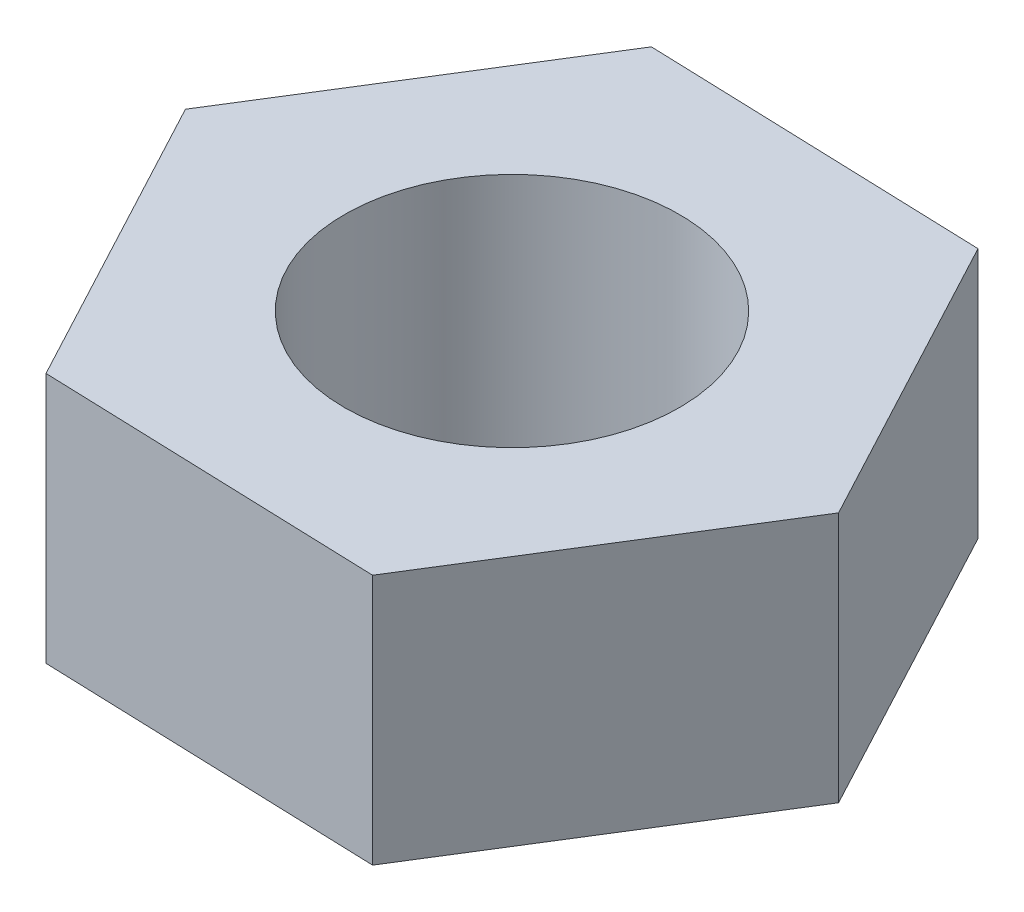
ISO-10303-21;
HEADER;
FILE_DESCRIPTION(('STEP AP214'),'2;1');
FILE_NAME('part.step','',(''),(''),'','','');
FILE_SCHEMA(('AUTOMOTIVE_DESIGN { 1 0 10303 214 1 1 1 1 }'));
ENDSEC;
DATA;
#1=APPLICATION_CONTEXT('core data for automotive mechanical design processes');
#2=APPLICATION_PROTOCOL_DEFINITION('international standard','automotive_design',2000,#1);
#3=PRODUCT_CONTEXT('',#1,'mechanical');
#4=PRODUCT('Part','Part','',(#3));
#5=PRODUCT_RELATED_PRODUCT_CATEGORY('part','',(#4));
#6=PRODUCT_DEFINITION_FORMATION('','',#4);
#7=PRODUCT_DEFINITION_CONTEXT('part definition',#1,'design');
#8=PRODUCT_DEFINITION('design','',#6,#7);
#9=PRODUCT_DEFINITION_SHAPE('','',#8);
#10=(LENGTH_UNIT() NAMED_UNIT(*) SI_UNIT(.MILLI.,.METRE.));
#11=(NAMED_UNIT(*) PLANE_ANGLE_UNIT() SI_UNIT($,.RADIAN.));
#12=(NAMED_UNIT(*) SI_UNIT($,.STERADIAN.) SOLID_ANGLE_UNIT());
#13=UNCERTAINTY_MEASURE_WITH_UNIT(LENGTH_MEASURE(1.E-05),#10,'distance_accuracy_value','');
#14=(GEOMETRIC_REPRESENTATION_CONTEXT(3) GLOBAL_UNCERTAINTY_ASSIGNED_CONTEXT((#13)) GLOBAL_UNIT_ASSIGNED_CONTEXT((#10,
#11,#12)) REPRESENTATION_CONTEXT('',''));
#15=CARTESIAN_POINT('',(0.,0.,0.));
#16=DIRECTION('',(0.,0.,1.));
#17=DIRECTION('',(1.,0.,0.));
#18=AXIS2_PLACEMENT_3D('',#15,#16,#17);
#19=CARTESIAN_POINT('',(0.,0.,0.));
#20=DIRECTION('',(0.,1.,0.));
#21=DIRECTION('',(0.,0.,1.));
#22=AXIS2_PLACEMENT_3D('',#19,#20,#21);
#23=CYLINDRICAL_SURFACE('',#22,2.);
#24=CARTESIAN_POINT('',(0.,0.,0.));
#25=DIRECTION('',(0.,1.,0.));
#26=DIRECTION('',(0.,0.,1.));
#27=AXIS2_PLACEMENT_3D('',#24,#25,#26);
#28=CIRCLE('',#27,2.);
#29=CARTESIAN_POINT('',(0.,0.,2.));
#30=VERTEX_POINT('',#29);
#31=EDGE_CURVE('E127',#30,#30,#28,.T.);
#32=ORIENTED_EDGE('',*,*,#31,.F.);
#33=EDGE_LOOP('',(#32));
#34=FACE_BOUND('',#33,.T.);
#35=CARTESIAN_POINT('',(0.,3.,0.));
#36=DIRECTION('',(0.,1.,0.));
#37=DIRECTION('',(0.,0.,1.));
#38=AXIS2_PLACEMENT_3D('',#35,#36,#37);
#39=CIRCLE('',#38,2.);
#40=CARTESIAN_POINT('',(0.,3.,2.));
#41=VERTEX_POINT('',#40);
#42=EDGE_CURVE('E41',#41,#41,#39,.F.);
#43=ORIENTED_EDGE('',*,*,#42,.F.);
#44=EDGE_LOOP('',(#43));
#45=FACE_BOUND('',#44,.T.);
#46=ADVANCED_FACE('F37',(#34,#45),#23,.F.);
#47=CARTESIAN_POINT('',(1.90071687975874,3.,3.56659623118927));
#48=DIRECTION('',(-0.848548322984266,0.,-0.529117891930135));
#49=DIRECTION('',(-0.529117891930135,0.,0.848548322984266));
#50=AXIS2_PLACEMENT_3D('',#47,#48,#49);
#51=PLANE('',#50);
#52=DIRECTION('',(0.529117891930135,0.,-0.848548322984266));
#53=VECTOR('',#52,1.);
#54=CARTESIAN_POINT('',(1.90071687975874,0.,3.56659623118927));
#55=LINE('',#54,#53);
#56=CARTESIAN_POINT('',(1.90071687975874,0.,3.56659623118927));
#57=VERTEX_POINT('',#56);
#58=CARTESIAN_POINT('',(4.03912138113112,0.,0.137229012321677));
#59=VERTEX_POINT('',#58);
#60=EDGE_CURVE('E123',#57,#59,#55,.T.);
#61=ORIENTED_EDGE('',*,*,#60,.T.);
#62=DIRECTION('',(0.,-1.,0.));
#63=VECTOR('',#62,1.);
#64=CARTESIAN_POINT('',(4.03912138113112,3.,0.137229012321677));
#65=LINE('',#64,#63);
#66=CARTESIAN_POINT('',(4.03912138113112,3.,0.137229012321677));
#67=VERTEX_POINT('',#66);
#68=EDGE_CURVE('E11',#67,#59,#65,.T.);
#69=ORIENTED_EDGE('',*,*,#68,.F.);
#70=DIRECTION('',(0.529117891930135,0.,-0.848548322984266));
#71=VECTOR('',#70,1.);
#72=CARTESIAN_POINT('',(1.90071687975874,3.,3.56659623118927));
#73=LINE('',#72,#71);
#74=CARTESIAN_POINT('',(1.90071687975874,3.,3.56659623118927));
#75=VERTEX_POINT('',#74);
#76=EDGE_CURVE('E90',#75,#67,#73,.T.);
#77=ORIENTED_EDGE('',*,*,#76,.F.);
#78=DIRECTION('',(0.,-1.,0.));
#79=VECTOR('',#78,1.);
#80=CARTESIAN_POINT('',(1.90071687975874,3.,3.56659623118927));
#81=LINE('',#80,#79);
#82=EDGE_CURVE('E119',#75,#57,#81,.T.);
#83=ORIENTED_EDGE('',*,*,#82,.T.);
#84=EDGE_LOOP('',(#61,#69,#77,#83));
#85=FACE_BOUND('',#84,.T.);
#86=ADVANCED_FACE('F39',(#85),#51,.F.);
#87=CARTESIAN_POINT('',(4.03912138113112,3.,0.137229012321677));
#88=DIRECTION('',(-0.882503697500499,0.,0.470305458077989));
#89=DIRECTION('',(0.470305458077989,0.,0.882503697500499));
#90=AXIS2_PLACEMENT_3D('',#87,#88,#89);
#91=PLANE('',#90);
#92=DIRECTION('',(-0.470305458077989,0.,-0.882503697500499));
#93=VECTOR('',#92,1.);
#94=CARTESIAN_POINT('',(4.03912138113112,0.,0.137229012321677));
#95=LINE('',#94,#93);
#96=CARTESIAN_POINT('',(2.13840450137238,0.,-3.4293672188676));
#97=VERTEX_POINT('',#96);
#98=EDGE_CURVE('E126',#59,#97,#95,.T.);
#99=ORIENTED_EDGE('',*,*,#98,.T.);
#100=DIRECTION('',(0.,-1.,0.));
#101=VECTOR('',#100,1.);
#102=CARTESIAN_POINT('',(2.13840450137238,3.,-3.4293672188676));
#103=LINE('',#102,#101);
#104=CARTESIAN_POINT('',(2.13840450137238,3.,-3.4293672188676));
#105=VERTEX_POINT('',#104);
#106=EDGE_CURVE('E47',#105,#97,#103,.T.);
#107=ORIENTED_EDGE('',*,*,#106,.F.);
#108=DIRECTION('',(-0.470305458077989,0.,-0.882503697500499));
#109=VECTOR('',#108,1.);
#110=CARTESIAN_POINT('',(4.03912138113112,3.,0.137229012321677));
#111=LINE('',#110,#109);
#112=EDGE_CURVE('E179',#67,#105,#111,.T.);
#113=ORIENTED_EDGE('',*,*,#112,.F.);
#114=ORIENTED_EDGE('',*,*,#68,.T.);
#115=EDGE_LOOP('',(#99,#107,#113,#114));
#116=FACE_BOUND('',#115,.T.);
#117=ADVANCED_FACE('F166',(#116),#91,.F.);
#118=CARTESIAN_POINT('',(2.13840450137238,3.,-3.4293672188676));
#119=DIRECTION('',(-0.0339553745162337,0.,0.999423350008124));
#120=DIRECTION('',(0.999423350008125,0.,0.0339553745162337));
#121=AXIS2_PLACEMENT_3D('',#118,#119,#120);
#122=PLANE('',#121);
#123=DIRECTION('',(-0.999423350008125,0.,-0.0339553745162337));
#124=VECTOR('',#123,1.);
#125=CARTESIAN_POINT('',(2.13840450137238,0.,-3.4293672188676));
#126=LINE('',#125,#124);
#127=CARTESIAN_POINT('',(-1.90071687975874,0.,-3.56659623118928));
#128=VERTEX_POINT('',#127);
#129=EDGE_CURVE('E129',#97,#128,#126,.T.);
#130=ORIENTED_EDGE('',*,*,#129,.T.);
#131=DIRECTION('',(0.,-1.,0.));
#132=VECTOR('',#131,1.);
#133=CARTESIAN_POINT('',(-1.90071687975874,3.,-3.56659623118928));
#134=LINE('',#133,#132);
#135=CARTESIAN_POINT('',(-1.90071687975874,3.,-3.56659623118928));
#136=VERTEX_POINT('',#135);
#137=EDGE_CURVE('E114',#136,#128,#134,.T.);
#138=ORIENTED_EDGE('',*,*,#137,.F.);
#139=DIRECTION('',(-0.999423350008125,0.,-0.0339553745162337));
#140=VECTOR('',#139,1.);
#141=CARTESIAN_POINT('',(2.13840450137238,3.,-3.4293672188676));
#142=LINE('',#141,#140);
#143=EDGE_CURVE('E105',#105,#136,#142,.T.);
#144=ORIENTED_EDGE('',*,*,#143,.F.);
#145=ORIENTED_EDGE('',*,*,#106,.T.);
#146=EDGE_LOOP('',(#130,#138,#144,#145));
#147=FACE_BOUND('',#146,.T.);
#148=ADVANCED_FACE('F141',(#147),#122,.F.);
#149=CARTESIAN_POINT('',(-1.90071687975874,3.,-3.56659623118928));
#150=DIRECTION('',(0.848548322984266,0.,0.529117891930135));
#151=DIRECTION('',(0.529117891930135,0.,-0.848548322984266));
#152=AXIS2_PLACEMENT_3D('',#149,#150,#151);
#153=PLANE('',#152);
#154=DIRECTION('',(-0.529117891930136,0.,0.848548322984266));
#155=VECTOR('',#154,1.);
#156=CARTESIAN_POINT('',(-1.90071687975874,0.,-3.56659623118928));
#157=LINE('',#156,#155);
#158=CARTESIAN_POINT('',(-4.03912138113112,0.,-0.137229012321677));
#159=VERTEX_POINT('',#158);
#160=EDGE_CURVE('E113',#128,#159,#157,.T.);
#161=ORIENTED_EDGE('',*,*,#160,.T.);
#162=DIRECTION('',(0.,-1.,0.));
#163=VECTOR('',#162,1.);
#164=CARTESIAN_POINT('',(-4.03912138113112,3.,-0.137229012321677));
#165=LINE('',#164,#163);
#166=CARTESIAN_POINT('',(-4.03912138113112,3.,-0.137229012321677));
#167=VERTEX_POINT('',#166);
#168=EDGE_CURVE('E110',#167,#159,#165,.T.);
#169=ORIENTED_EDGE('',*,*,#168,.F.);
#170=DIRECTION('',(-0.529117891930136,0.,0.848548322984266));
#171=VECTOR('',#170,1.);
#172=CARTESIAN_POINT('',(-1.90071687975874,3.,-3.56659623118928));
#173=LINE('',#172,#171);
#174=EDGE_CURVE('E98',#136,#167,#173,.T.);
#175=ORIENTED_EDGE('',*,*,#174,.F.);
#176=ORIENTED_EDGE('',*,*,#137,.T.);
#177=EDGE_LOOP('',(#161,#169,#175,#176));
#178=FACE_BOUND('',#177,.T.);
#179=ADVANCED_FACE('F111',(#178),#153,.F.);
#180=CARTESIAN_POINT('',(-4.03912138113112,3.,-0.137229012321677));
#181=DIRECTION('',(0.882503697500499,0.,-0.470305458077989));
#182=DIRECTION('',(-0.470305458077989,0.,-0.882503697500499));
#183=AXIS2_PLACEMENT_3D('',#180,#181,#182);
#184=PLANE('',#183);
#185=DIRECTION('',(0.470305458077989,0.,0.882503697500499));
#186=VECTOR('',#185,1.);
#187=CARTESIAN_POINT('',(-4.03912138113112,0.,-0.137229012321677));
#188=LINE('',#187,#186);
#189=CARTESIAN_POINT('',(-2.13840450137238,0.,3.4293672188676));
#190=VERTEX_POINT('',#189);
#191=EDGE_CURVE('E78',#159,#190,#188,.T.);
#192=ORIENTED_EDGE('',*,*,#191,.T.);
#193=DIRECTION('',(0.,-1.,0.));
#194=VECTOR('',#193,1.);
#195=CARTESIAN_POINT('',(-2.13840450137238,3.,3.4293672188676));
#196=LINE('',#195,#194);
#197=CARTESIAN_POINT('',(-2.13840450137238,3.,3.4293672188676));
#198=VERTEX_POINT('',#197);
#199=EDGE_CURVE('E115',#198,#190,#196,.T.);
#200=ORIENTED_EDGE('',*,*,#199,.F.);
#201=DIRECTION('',(0.470305458077989,0.,0.882503697500499));
#202=VECTOR('',#201,1.);
#203=CARTESIAN_POINT('',(-4.03912138113112,3.,-0.137229012321677));
#204=LINE('',#203,#202);
#205=EDGE_CURVE('E103',#167,#198,#204,.T.);
#206=ORIENTED_EDGE('',*,*,#205,.F.);
#207=ORIENTED_EDGE('',*,*,#168,.T.);
#208=EDGE_LOOP('',(#192,#200,#206,#207));
#209=FACE_BOUND('',#208,.T.);
#210=ADVANCED_FACE('F117',(#209),#184,.F.);
#211=CARTESIAN_POINT('',(-2.13840450137238,3.,3.4293672188676));
#212=DIRECTION('',(0.0339553745162338,0.,-0.999423350008124));
#213=DIRECTION('',(-0.999423350008125,0.,-0.0339553745162338));
#214=AXIS2_PLACEMENT_3D('',#211,#212,#213);
#215=PLANE('',#214);
#216=DIRECTION('',(0.999423350008125,0.,0.0339553745162338));
#217=VECTOR('',#216,1.);
#218=CARTESIAN_POINT('',(-2.13840450137238,0.,3.4293672188676));
#219=LINE('',#218,#217);
#220=EDGE_CURVE('E84',#190,#57,#219,.T.);
#221=ORIENTED_EDGE('',*,*,#220,.T.);
#222=ORIENTED_EDGE('',*,*,#82,.F.);
#223=DIRECTION('',(0.999423350008125,0.,0.0339553745162338));
#224=VECTOR('',#223,1.);
#225=CARTESIAN_POINT('',(-2.13840450137238,3.,3.4293672188676));
#226=LINE('',#225,#224);
#227=EDGE_CURVE('E55',#198,#75,#226,.T.);
#228=ORIENTED_EDGE('',*,*,#227,.F.);
#229=ORIENTED_EDGE('',*,*,#199,.T.);
#230=EDGE_LOOP('',(#221,#222,#228,#229));
#231=FACE_BOUND('',#230,.T.);
#232=ADVANCED_FACE('F148',(#231),#215,.F.);
#233=CARTESIAN_POINT('',(0.,3.,0.));
#234=DIRECTION('',(0.,1.,0.));
#235=DIRECTION('',(0.,0.,1.));
#236=AXIS2_PLACEMENT_3D('',#233,#234,#235);
#237=PLANE('',#236);
#238=ORIENTED_EDGE('',*,*,#76,.T.);
#239=ORIENTED_EDGE('',*,*,#112,.T.);
#240=ORIENTED_EDGE('',*,*,#143,.T.);
#241=ORIENTED_EDGE('',*,*,#174,.T.);
#242=ORIENTED_EDGE('',*,*,#205,.T.);
#243=ORIENTED_EDGE('',*,*,#227,.T.);
#244=EDGE_LOOP('',(#238,#239,#240,#241,#242,#243));
#245=FACE_BOUND('',#244,.T.);
#246=ORIENTED_EDGE('',*,*,#42,.T.);
#247=EDGE_LOOP('',(#246));
#248=FACE_BOUND('',#247,.T.);
#249=ADVANCED_FACE('F100',(#245,#248),#237,.T.);
#250=CARTESIAN_POINT('',(0.,0.,0.));
#251=DIRECTION('',(0.,1.,0.));
#252=DIRECTION('',(0.,0.,1.));
#253=AXIS2_PLACEMENT_3D('',#250,#251,#252);
#254=PLANE('',#253);
#255=ORIENTED_EDGE('',*,*,#31,.T.);
#256=EDGE_LOOP('',(#255));
#257=FACE_BOUND('',#256,.T.);
#258=ORIENTED_EDGE('',*,*,#60,.F.);
#259=ORIENTED_EDGE('',*,*,#220,.F.);
#260=ORIENTED_EDGE('',*,*,#191,.F.);
#261=ORIENTED_EDGE('',*,*,#160,.F.);
#262=ORIENTED_EDGE('',*,*,#129,.F.);
#263=ORIENTED_EDGE('',*,*,#98,.F.);
#264=EDGE_LOOP('',(#258,#259,#260,#261,#262,#263));
#265=FACE_BOUND('',#264,.T.);
#266=ADVANCED_FACE('F145',(#257,#265),#254,.F.);
#267=CLOSED_SHELL('',(#46,#86,#117,#148,#179,#210,#232,#249,#266));
#268=MANIFOLD_SOLID_BREP('B2',#267);
#269=ADVANCED_BREP_SHAPE_REPRESENTATION('',(#18,#268),#14);
#270=SHAPE_DEFINITION_REPRESENTATION(#9,#269);
ENDSEC;
END-ISO-10303-21;
